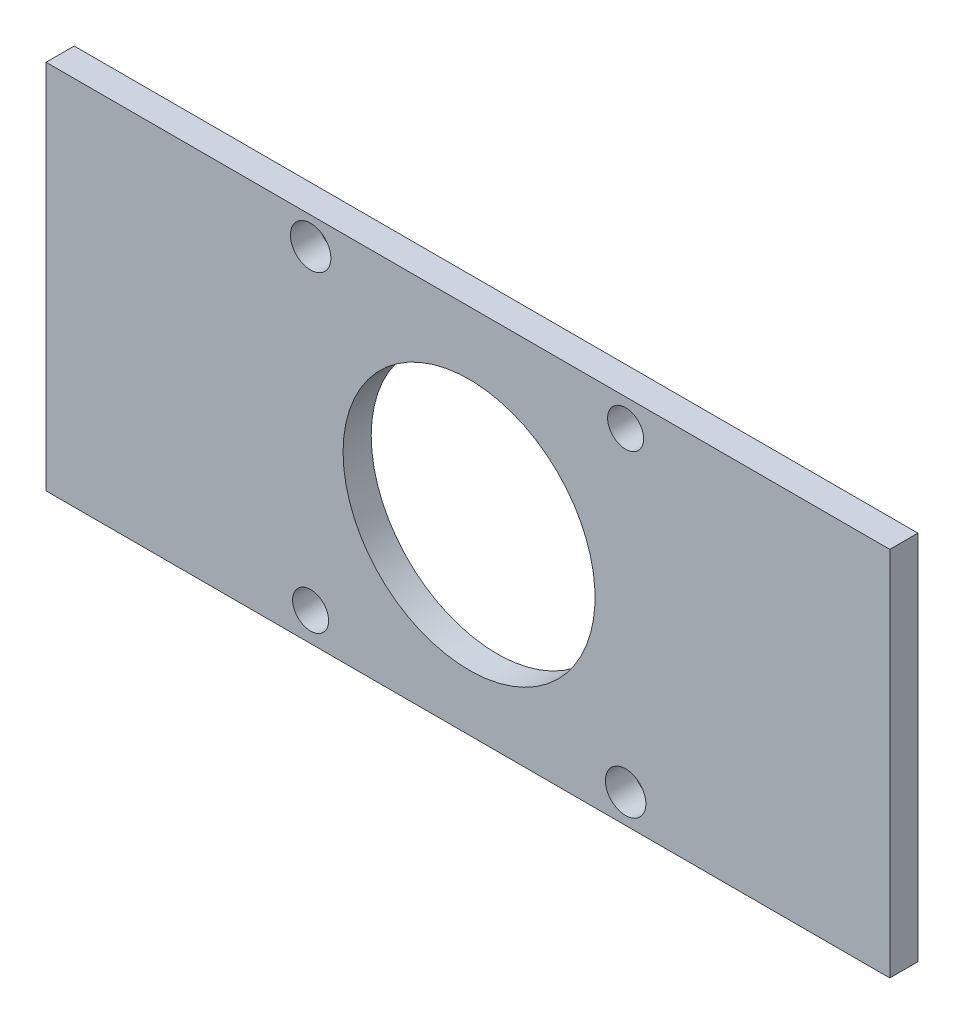
ISO-10303-21;
HEADER;
FILE_DESCRIPTION(('STEP AP214'),'2;1');
FILE_NAME('part.step','',(''),(''),'','','');
FILE_SCHEMA(('AUTOMOTIVE_DESIGN { 1 0 10303 214 1 1 1 1 }'));
ENDSEC;
DATA;
#1=APPLICATION_CONTEXT('core data for automotive mechanical design processes');
#2=APPLICATION_PROTOCOL_DEFINITION('international standard','automotive_design',2000,#1);
#3=PRODUCT_CONTEXT('',#1,'mechanical');
#4=PRODUCT('Part','Part','',(#3));
#5=PRODUCT_RELATED_PRODUCT_CATEGORY('part','',(#4));
#6=PRODUCT_DEFINITION_FORMATION('','',#4);
#7=PRODUCT_DEFINITION_CONTEXT('part definition',#1,'design');
#8=PRODUCT_DEFINITION('design','',#6,#7);
#9=PRODUCT_DEFINITION_SHAPE('','',#8);
#10=(LENGTH_UNIT() NAMED_UNIT(*) SI_UNIT(.MILLI.,.METRE.));
#11=(NAMED_UNIT(*) PLANE_ANGLE_UNIT() SI_UNIT($,.RADIAN.));
#12=(NAMED_UNIT(*) SI_UNIT($,.STERADIAN.) SOLID_ANGLE_UNIT());
#13=UNCERTAINTY_MEASURE_WITH_UNIT(LENGTH_MEASURE(1.E-05),#10,'distance_accuracy_value','');
#14=(GEOMETRIC_REPRESENTATION_CONTEXT(3) GLOBAL_UNCERTAINTY_ASSIGNED_CONTEXT((#13)) GLOBAL_UNIT_ASSIGNED_CONTEXT((#10,
#11,#12)) REPRESENTATION_CONTEXT('',''));
#15=CARTESIAN_POINT('',(0.,0.,0.));
#16=DIRECTION('',(0.,0.,1.));
#17=DIRECTION('',(1.,0.,0.));
#18=AXIS2_PLACEMENT_3D('',#15,#16,#17);
#19=CARTESIAN_POINT('',(45.085,-23.622,1.5875));
#20=DIRECTION('',(-1.,0.,0.));
#21=DIRECTION('',(0.,0.,1.));
#22=AXIS2_PLACEMENT_3D('',#19,#20,#21);
#23=PLANE('',#22);
#24=DIRECTION('',(0.,1.,0.));
#25=VECTOR('',#24,1.);
#26=CARTESIAN_POINT('',(45.085,-23.622,-1.5875));
#27=LINE('',#26,#25);
#28=CARTESIAN_POINT('',(45.085,-23.622,-1.5875));
#29=VERTEX_POINT('',#28);
#30=CARTESIAN_POINT('',(45.085,18.288,-1.5875));
#31=VERTEX_POINT('',#30);
#32=EDGE_CURVE('E96',#29,#31,#27,.T.);
#33=ORIENTED_EDGE('',*,*,#32,.T.);
#34=DIRECTION('',(0.,0.,-1.));
#35=VECTOR('',#34,1.);
#36=CARTESIAN_POINT('',(45.085,18.288,1.5875));
#37=LINE('',#36,#35);
#38=CARTESIAN_POINT('',(45.085,18.288,1.5875));
#39=VERTEX_POINT('',#38);
#40=EDGE_CURVE('E11',#39,#31,#37,.T.);
#41=ORIENTED_EDGE('',*,*,#40,.F.);
#42=DIRECTION('',(0.,1.,0.));
#43=VECTOR('',#42,1.);
#44=CARTESIAN_POINT('',(45.085,-23.622,1.5875));
#45=LINE('',#44,#43);
#46=CARTESIAN_POINT('',(45.085,-23.622,1.5875));
#47=VERTEX_POINT('',#46);
#48=EDGE_CURVE('E84',#47,#39,#45,.T.);
#49=ORIENTED_EDGE('',*,*,#48,.F.);
#50=DIRECTION('',(0.,0.,-1.));
#51=VECTOR('',#50,1.);
#52=CARTESIAN_POINT('',(45.085,-23.622,1.5875));
#53=LINE('',#52,#51);
#54=EDGE_CURVE('E92',#47,#29,#53,.T.);
#55=ORIENTED_EDGE('',*,*,#54,.T.);
#56=EDGE_LOOP('',(#33,#41,#49,#55));
#57=FACE_BOUND('',#56,.T.);
#58=ADVANCED_FACE('F33',(#57),#23,.F.);
#59=CARTESIAN_POINT('',(-50.165,18.288,1.5875));
#60=DIRECTION('',(0.,-1.,0.));
#61=DIRECTION('',(0.,0.,-1.));
#62=AXIS2_PLACEMENT_3D('',#59,#60,#61);
#63=PLANE('',#62);
#64=DIRECTION('',(-1.,0.,0.));
#65=VECTOR('',#64,1.);
#66=CARTESIAN_POINT('',(-50.165,18.288,-1.5875));
#67=LINE('',#66,#65);
#68=CARTESIAN_POINT('',(-50.165,18.288,-1.5875));
#69=VERTEX_POINT('',#68);
#70=EDGE_CURVE('E88',#31,#69,#67,.T.);
#71=ORIENTED_EDGE('',*,*,#70,.T.);
#72=DIRECTION('',(0.,0.,-1.));
#73=VECTOR('',#72,1.);
#74=CARTESIAN_POINT('',(-50.165,18.288,1.5875));
#75=LINE('',#74,#73);
#76=CARTESIAN_POINT('',(-50.165,18.288,1.5875));
#77=VERTEX_POINT('',#76);
#78=EDGE_CURVE('E41',#77,#69,#75,.T.);
#79=ORIENTED_EDGE('',*,*,#78,.F.);
#80=DIRECTION('',(-1.,0.,0.));
#81=VECTOR('',#80,1.);
#82=CARTESIAN_POINT('',(-50.165,18.288,1.5875));
#83=LINE('',#82,#81);
#84=EDGE_CURVE('E79',#39,#77,#83,.T.);
#85=ORIENTED_EDGE('',*,*,#84,.F.);
#86=ORIENTED_EDGE('',*,*,#40,.T.);
#87=EDGE_LOOP('',(#71,#79,#85,#86));
#88=FACE_BOUND('',#87,.T.);
#89=ADVANCED_FACE('F87',(#88),#63,.F.);
#90=CARTESIAN_POINT('',(-50.165,-23.622,1.5875));
#91=DIRECTION('',(1.,0.,0.));
#92=DIRECTION('',(0.,0.,-1.));
#93=AXIS2_PLACEMENT_3D('',#90,#91,#92);
#94=PLANE('',#93);
#95=DIRECTION('',(0.,-1.,0.));
#96=VECTOR('',#95,1.);
#97=CARTESIAN_POINT('',(-50.165,-23.622,-1.5875));
#98=LINE('',#97,#96);
#99=CARTESIAN_POINT('',(-50.165,-23.622,-1.5875));
#100=VERTEX_POINT('',#99);
#101=EDGE_CURVE('E66',#69,#100,#98,.T.);
#102=ORIENTED_EDGE('',*,*,#101,.T.);
#103=DIRECTION('',(0.,0.,-1.));
#104=VECTOR('',#103,1.);
#105=CARTESIAN_POINT('',(-50.165,-23.622,1.5875));
#106=LINE('',#105,#104);
#107=CARTESIAN_POINT('',(-50.165,-23.622,1.5875));
#108=VERTEX_POINT('',#107);
#109=EDGE_CURVE('E89',#108,#100,#106,.T.);
#110=ORIENTED_EDGE('',*,*,#109,.F.);
#111=DIRECTION('',(0.,-1.,0.));
#112=VECTOR('',#111,1.);
#113=CARTESIAN_POINT('',(-50.165,-23.622,1.5875));
#114=LINE('',#113,#112);
#115=EDGE_CURVE('E82',#77,#108,#114,.T.);
#116=ORIENTED_EDGE('',*,*,#115,.F.);
#117=ORIENTED_EDGE('',*,*,#78,.T.);
#118=EDGE_LOOP('',(#102,#110,#116,#117));
#119=FACE_BOUND('',#118,.T.);
#120=ADVANCED_FACE('F90',(#119),#94,.F.);
#121=CARTESIAN_POINT('',(-50.165,-23.622,1.5875));
#122=DIRECTION('',(0.,1.,0.));
#123=DIRECTION('',(0.,0.,1.));
#124=AXIS2_PLACEMENT_3D('',#121,#122,#123);
#125=PLANE('',#124);
#126=DIRECTION('',(1.,0.,0.));
#127=VECTOR('',#126,1.);
#128=CARTESIAN_POINT('',(-50.165,-23.622,-1.5875));
#129=LINE('',#128,#127);
#130=EDGE_CURVE('E72',#100,#29,#129,.T.);
#131=ORIENTED_EDGE('',*,*,#130,.T.);
#132=ORIENTED_EDGE('',*,*,#54,.F.);
#133=DIRECTION('',(1.,0.,0.));
#134=VECTOR('',#133,1.);
#135=CARTESIAN_POINT('',(-50.165,-23.622,1.5875));
#136=LINE('',#135,#134);
#137=EDGE_CURVE('E49',#108,#47,#136,.T.);
#138=ORIENTED_EDGE('',*,*,#137,.F.);
#139=ORIENTED_EDGE('',*,*,#109,.T.);
#140=EDGE_LOOP('',(#131,#132,#138,#139));
#141=FACE_BOUND('',#140,.T.);
#142=ADVANCED_FACE('F104',(#141),#125,.F.);
#143=CARTESIAN_POINT('',(0.,0.,1.5875));
#144=DIRECTION('',(0.,0.,-1.));
#145=DIRECTION('',(-1.,0.,0.));
#146=AXIS2_PLACEMENT_3D('',#143,#144,#145);
#147=PLANE('',#146);
#148=CARTESIAN_POINT('',(-20.2998960957146,-20.3646067194633,1.5875));
#149=DIRECTION('',(0.,0.,-1.));
#150=DIRECTION('',(-1.,0.,0.));
#151=AXIS2_PLACEMENT_3D('',#148,#149,#150);
#152=CIRCLE('',#151,2.032);
#153=CARTESIAN_POINT('',(-22.3318960957146,-20.3646067194633,1.5875));
#154=VERTEX_POINT('',#153);
#155=EDGE_CURVE('E131',#154,#154,#152,.T.);
#156=ORIENTED_EDGE('',*,*,#155,.T.);
#157=EDGE_LOOP('',(#156));
#158=FACE_BOUND('',#157,.T.);
#159=CARTESIAN_POINT('',(-20.2998960957146,15.1953932805367,1.5875));
#160=DIRECTION('',(0.,0.,-1.));
#161=DIRECTION('',(-1.,0.,0.));
#162=AXIS2_PLACEMENT_3D('',#159,#160,#161);
#163=CIRCLE('',#162,2.286);
#164=CARTESIAN_POINT('',(-22.5858960957146,15.1953932805367,1.5875));
#165=VERTEX_POINT('',#164);
#166=EDGE_CURVE('E125',#165,#165,#163,.T.);
#167=ORIENTED_EDGE('',*,*,#166,.T.);
#168=EDGE_LOOP('',(#167));
#169=FACE_BOUND('',#168,.T.);
#170=CARTESIAN_POINT('',(15.2601039042854,15.1953932805367,1.5875));
#171=DIRECTION('',(0.,0.,-1.));
#172=DIRECTION('',(-1.,0.,0.));
#173=AXIS2_PLACEMENT_3D('',#170,#171,#172);
#174=CIRCLE('',#173,2.032);
#175=CARTESIAN_POINT('',(13.2281039042854,15.1953932805367,1.5875));
#176=VERTEX_POINT('',#175);
#177=EDGE_CURVE('E119',#176,#176,#174,.T.);
#178=ORIENTED_EDGE('',*,*,#177,.T.);
#179=EDGE_LOOP('',(#178));
#180=FACE_BOUND('',#179,.T.);
#181=CARTESIAN_POINT('',(15.2601039042854,-20.3646067194633,1.5875));
#182=DIRECTION('',(0.,0.,-1.));
#183=DIRECTION('',(-1.,0.,0.));
#184=AXIS2_PLACEMENT_3D('',#181,#182,#183);
#185=CIRCLE('',#184,2.286);
#186=CARTESIAN_POINT('',(12.9741039042854,-20.3646067194633,1.5875));
#187=VERTEX_POINT('',#186);
#188=EDGE_CURVE('E113',#187,#187,#185,.T.);
#189=ORIENTED_EDGE('',*,*,#188,.T.);
#190=EDGE_LOOP('',(#189));
#191=FACE_BOUND('',#190,.T.);
#192=CARTESIAN_POINT('',(-2.41300000000002,-3.048,1.5875));
#193=DIRECTION('',(0.,0.,-1.));
#194=DIRECTION('',(-1.,0.,0.));
#195=AXIS2_PLACEMENT_3D('',#192,#193,#194);
#196=CIRCLE('',#195,14.224);
#197=CARTESIAN_POINT('',(-16.637,-3.048,1.5875));
#198=VERTEX_POINT('',#197);
#199=EDGE_CURVE('E99',#198,#198,#196,.T.);
#200=ORIENTED_EDGE('',*,*,#199,.T.);
#201=EDGE_LOOP('',(#200));
#202=FACE_BOUND('',#201,.T.);
#203=ORIENTED_EDGE('',*,*,#48,.T.);
#204=ORIENTED_EDGE('',*,*,#84,.T.);
#205=ORIENTED_EDGE('',*,*,#115,.T.);
#206=ORIENTED_EDGE('',*,*,#137,.T.);
#207=EDGE_LOOP('',(#203,#204,#205,#206));
#208=FACE_BOUND('',#207,.T.);
#209=ADVANCED_FACE('F80',(#158,#169,#180,#191,#202,#208),#147,.F.);
#210=CARTESIAN_POINT('',(0.,0.,-1.5875));
#211=DIRECTION('',(0.,0.,-1.));
#212=DIRECTION('',(-1.,0.,0.));
#213=AXIS2_PLACEMENT_3D('',#210,#211,#212);
#214=PLANE('',#213);
#215=CARTESIAN_POINT('',(-20.2998960957146,-20.3646067194633,-1.5875));
#216=DIRECTION('',(0.,0.,-1.));
#217=DIRECTION('',(-1.,0.,0.));
#218=AXIS2_PLACEMENT_3D('',#215,#216,#217);
#219=CIRCLE('',#218,2.032);
#220=CARTESIAN_POINT('',(-22.3318960957146,-20.3646067194633,-1.5875));
#221=VERTEX_POINT('',#220);
#222=EDGE_CURVE('E134',#221,#221,#219,.T.);
#223=ORIENTED_EDGE('',*,*,#222,.F.);
#224=EDGE_LOOP('',(#223));
#225=FACE_BOUND('',#224,.T.);
#226=CARTESIAN_POINT('',(-20.2998960957146,15.1953932805367,-1.5875));
#227=DIRECTION('',(0.,0.,-1.));
#228=DIRECTION('',(-1.,0.,0.));
#229=AXIS2_PLACEMENT_3D('',#226,#227,#228);
#230=CIRCLE('',#229,2.286);
#231=CARTESIAN_POINT('',(-22.5858960957146,15.1953932805367,-1.5875));
#232=VERTEX_POINT('',#231);
#233=EDGE_CURVE('E128',#232,#232,#230,.T.);
#234=ORIENTED_EDGE('',*,*,#233,.F.);
#235=EDGE_LOOP('',(#234));
#236=FACE_BOUND('',#235,.T.);
#237=CARTESIAN_POINT('',(15.2601039042854,15.1953932805367,-1.5875));
#238=DIRECTION('',(0.,0.,-1.));
#239=DIRECTION('',(-1.,0.,0.));
#240=AXIS2_PLACEMENT_3D('',#237,#238,#239);
#241=CIRCLE('',#240,2.032);
#242=CARTESIAN_POINT('',(13.2281039042854,15.1953932805367,-1.5875));
#243=VERTEX_POINT('',#242);
#244=EDGE_CURVE('E122',#243,#243,#241,.T.);
#245=ORIENTED_EDGE('',*,*,#244,.F.);
#246=EDGE_LOOP('',(#245));
#247=FACE_BOUND('',#246,.T.);
#248=CARTESIAN_POINT('',(15.2601039042854,-20.3646067194633,-1.5875));
#249=DIRECTION('',(0.,0.,-1.));
#250=DIRECTION('',(-1.,0.,0.));
#251=AXIS2_PLACEMENT_3D('',#248,#249,#250);
#252=CIRCLE('',#251,2.286);
#253=CARTESIAN_POINT('',(12.9741039042854,-20.3646067194633,-1.5875));
#254=VERTEX_POINT('',#253);
#255=EDGE_CURVE('E116',#254,#254,#252,.T.);
#256=ORIENTED_EDGE('',*,*,#255,.F.);
#257=EDGE_LOOP('',(#256));
#258=FACE_BOUND('',#257,.T.);
#259=CARTESIAN_POINT('',(-2.41300000000002,-3.048,-1.5875));
#260=DIRECTION('',(0.,0.,-1.));
#261=DIRECTION('',(-1.,0.,0.));
#262=AXIS2_PLACEMENT_3D('',#259,#260,#261);
#263=CIRCLE('',#262,14.224);
#264=CARTESIAN_POINT('',(-16.637,-3.048,-1.5875));
#265=VERTEX_POINT('',#264);
#266=EDGE_CURVE('E110',#265,#265,#263,.T.);
#267=ORIENTED_EDGE('',*,*,#266,.F.);
#268=EDGE_LOOP('',(#267));
#269=FACE_BOUND('',#268,.T.);
#270=ORIENTED_EDGE('',*,*,#32,.F.);
#271=ORIENTED_EDGE('',*,*,#130,.F.);
#272=ORIENTED_EDGE('',*,*,#101,.F.);
#273=ORIENTED_EDGE('',*,*,#70,.F.);
#274=EDGE_LOOP('',(#270,#271,#272,#273));
#275=FACE_BOUND('',#274,.T.);
#276=ADVANCED_FACE('F107',(#225,#236,#247,#258,#269,#275),#214,.T.);
#277=CARTESIAN_POINT('',(-2.41300000000002,-3.048,1.5875));
#278=DIRECTION('',(0.,0.,-1.));
#279=DIRECTION('',(-1.,0.,0.));
#280=AXIS2_PLACEMENT_3D('',#277,#278,#279);
#281=CYLINDRICAL_SURFACE('',#280,14.224);
#282=ORIENTED_EDGE('',*,*,#199,.F.);
#283=EDGE_LOOP('',(#282));
#284=FACE_BOUND('',#283,.T.);
#285=ORIENTED_EDGE('',*,*,#266,.T.);
#286=EDGE_LOOP('',(#285));
#287=FACE_BOUND('',#286,.T.);
#288=ADVANCED_FACE('F151',(#284,#287),#281,.F.);
#289=CARTESIAN_POINT('',(15.2601039042854,-20.3646067194633,1.5875));
#290=DIRECTION('',(0.,0.,-1.));
#291=DIRECTION('',(-1.,0.,0.));
#292=AXIS2_PLACEMENT_3D('',#289,#290,#291);
#293=CYLINDRICAL_SURFACE('',#292,2.286);
#294=ORIENTED_EDGE('',*,*,#188,.F.);
#295=EDGE_LOOP('',(#294));
#296=FACE_BOUND('',#295,.T.);
#297=ORIENTED_EDGE('',*,*,#255,.T.);
#298=EDGE_LOOP('',(#297));
#299=FACE_BOUND('',#298,.T.);
#300=ADVANCED_FACE('F162',(#296,#299),#293,.F.);
#301=CARTESIAN_POINT('',(15.2601039042854,15.1953932805367,1.5875));
#302=DIRECTION('',(0.,0.,-1.));
#303=DIRECTION('',(-1.,0.,0.));
#304=AXIS2_PLACEMENT_3D('',#301,#302,#303);
#305=CYLINDRICAL_SURFACE('',#304,2.032);
#306=ORIENTED_EDGE('',*,*,#177,.F.);
#307=EDGE_LOOP('',(#306));
#308=FACE_BOUND('',#307,.T.);
#309=ORIENTED_EDGE('',*,*,#244,.T.);
#310=EDGE_LOOP('',(#309));
#311=FACE_BOUND('',#310,.T.);
#312=ADVANCED_FACE('F169',(#308,#311),#305,.F.);
#313=CARTESIAN_POINT('',(-20.2998960957146,15.1953932805367,1.5875));
#314=DIRECTION('',(0.,0.,-1.));
#315=DIRECTION('',(-1.,0.,0.));
#316=AXIS2_PLACEMENT_3D('',#313,#314,#315);
#317=CYLINDRICAL_SURFACE('',#316,2.286);
#318=ORIENTED_EDGE('',*,*,#166,.F.);
#319=EDGE_LOOP('',(#318));
#320=FACE_BOUND('',#319,.T.);
#321=ORIENTED_EDGE('',*,*,#233,.T.);
#322=EDGE_LOOP('',(#321));
#323=FACE_BOUND('',#322,.T.);
#324=ADVANCED_FACE('F145',(#320,#323),#317,.F.);
#325=CARTESIAN_POINT('',(-20.2998960957146,-20.3646067194633,1.5875));
#326=DIRECTION('',(0.,0.,-1.));
#327=DIRECTION('',(-1.,0.,0.));
#328=AXIS2_PLACEMENT_3D('',#325,#326,#327);
#329=CYLINDRICAL_SURFACE('',#328,2.032);
#330=ORIENTED_EDGE('',*,*,#155,.F.);
#331=EDGE_LOOP('',(#330));
#332=FACE_BOUND('',#331,.T.);
#333=ORIENTED_EDGE('',*,*,#222,.T.);
#334=EDGE_LOOP('',(#333));
#335=FACE_BOUND('',#334,.T.);
#336=ADVANCED_FACE('F142',(#332,#335),#329,.F.);
#337=CLOSED_SHELL('',(#58,#89,#120,#142,#209,#276,#288,#300,#312,#324,#336));
#338=MANIFOLD_SOLID_BREP('B2',#337);
#339=ADVANCED_BREP_SHAPE_REPRESENTATION('',(#18,#338),#14);
#340=SHAPE_DEFINITION_REPRESENTATION(#9,#339);
ENDSEC;
END-ISO-10303-21;
